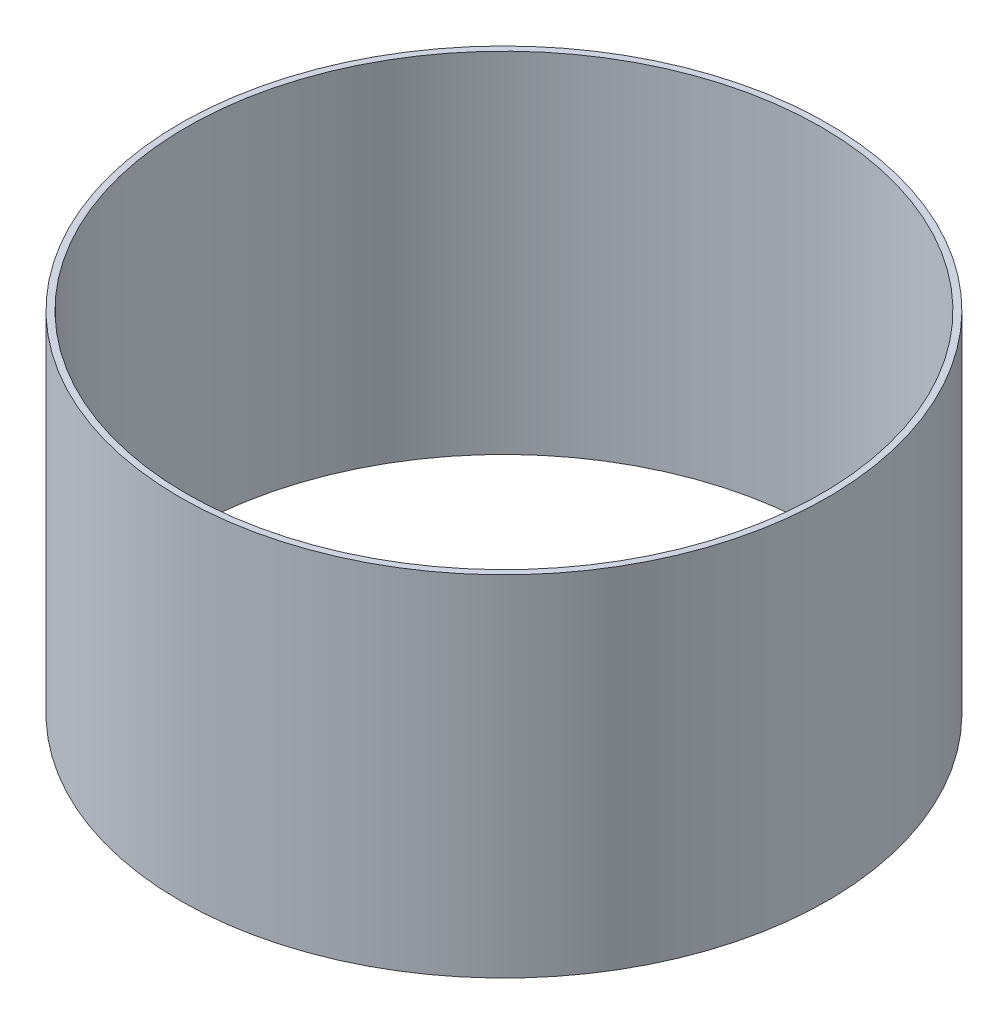
ISO-10303-21;
HEADER;
FILE_DESCRIPTION(('STEP AP214'),'2;1');
FILE_NAME('part.step','',(''),(''),'','','');
FILE_SCHEMA(('AUTOMOTIVE_DESIGN { 1 0 10303 214 1 1 1 1 }'));
ENDSEC;
DATA;
#1=APPLICATION_CONTEXT('core data for automotive mechanical design processes');
#2=APPLICATION_PROTOCOL_DEFINITION('international standard','automotive_design',2000,#1);
#3=PRODUCT_CONTEXT('',#1,'mechanical');
#4=PRODUCT('Part','Part','',(#3));
#5=PRODUCT_RELATED_PRODUCT_CATEGORY('part','',(#4));
#6=PRODUCT_DEFINITION_FORMATION('','',#4);
#7=PRODUCT_DEFINITION_CONTEXT('part definition',#1,'design');
#8=PRODUCT_DEFINITION('design','',#6,#7);
#9=PRODUCT_DEFINITION_SHAPE('','',#8);
#10=(LENGTH_UNIT() NAMED_UNIT(*) SI_UNIT(.MILLI.,.METRE.));
#11=(NAMED_UNIT(*) PLANE_ANGLE_UNIT() SI_UNIT($,.RADIAN.));
#12=(NAMED_UNIT(*) SI_UNIT($,.STERADIAN.) SOLID_ANGLE_UNIT());
#13=UNCERTAINTY_MEASURE_WITH_UNIT(LENGTH_MEASURE(1.E-05),#10,'distance_accuracy_value','');
#14=(GEOMETRIC_REPRESENTATION_CONTEXT(3) GLOBAL_UNCERTAINTY_ASSIGNED_CONTEXT((#13)) GLOBAL_UNIT_ASSIGNED_CONTEXT((#10,
#11,#12)) REPRESENTATION_CONTEXT('',''));
#15=CARTESIAN_POINT('',(0.,0.,0.));
#16=DIRECTION('',(0.,0.,1.));
#17=DIRECTION('',(1.,0.,0.));
#18=AXIS2_PLACEMENT_3D('',#15,#16,#17);
#19=CARTESIAN_POINT('',(0.,55.,0.));
#20=DIRECTION('',(0.,1.,0.));
#21=DIRECTION('',(0.,0.,1.));
#22=AXIS2_PLACEMENT_3D('',#19,#20,#21);
#23=PLANE('',#22);
#24=CARTESIAN_POINT('',(0.,55.,0.));
#25=DIRECTION('',(0.,1.,0.));
#26=DIRECTION('',(0.,0.,1.));
#27=AXIS2_PLACEMENT_3D('',#24,#25,#26);
#28=CIRCLE('',#27,51.);
#29=CARTESIAN_POINT('',(0.,55.,51.));
#30=VERTEX_POINT('',#29);
#31=EDGE_CURVE('E10',#30,#30,#28,.T.);
#32=ORIENTED_EDGE('',*,*,#31,.T.);
#33=EDGE_LOOP('',(#32));
#34=FACE_BOUND('',#33,.T.);
#35=CARTESIAN_POINT('',(0.,55.,0.));
#36=DIRECTION('',(0.,1.,0.));
#37=DIRECTION('',(0.,0.,1.));
#38=AXIS2_PLACEMENT_3D('',#35,#36,#37);
#39=CIRCLE('',#38,50.);
#40=CARTESIAN_POINT('',(0.,55.,50.));
#41=VERTEX_POINT('',#40);
#42=EDGE_CURVE('E50',#41,#41,#39,.T.);
#43=ORIENTED_EDGE('',*,*,#42,.F.);
#44=EDGE_LOOP('',(#43));
#45=FACE_BOUND('',#44,.T.);
#46=ADVANCED_FACE('F37',(#34,#45),#23,.T.);
#47=CARTESIAN_POINT('',(0.,0.,0.));
#48=DIRECTION('',(0.,1.,0.));
#49=DIRECTION('',(0.,0.,1.));
#50=AXIS2_PLACEMENT_3D('',#47,#48,#49);
#51=PLANE('',#50);
#52=CARTESIAN_POINT('',(0.,0.,0.));
#53=DIRECTION('',(0.,1.,0.));
#54=DIRECTION('',(0.,0.,1.));
#55=AXIS2_PLACEMENT_3D('',#52,#53,#54);
#56=CIRCLE('',#55,51.);
#57=CARTESIAN_POINT('',(0.,0.,51.));
#58=VERTEX_POINT('',#57);
#59=EDGE_CURVE('E41',#58,#58,#56,.T.);
#60=ORIENTED_EDGE('',*,*,#59,.F.);
#61=EDGE_LOOP('',(#60));
#62=FACE_BOUND('',#61,.T.);
#63=CARTESIAN_POINT('',(0.,0.,0.));
#64=DIRECTION('',(0.,1.,0.));
#65=DIRECTION('',(0.,0.,1.));
#66=AXIS2_PLACEMENT_3D('',#63,#64,#65);
#67=CIRCLE('',#66,50.);
#68=CARTESIAN_POINT('',(0.,0.,50.));
#69=VERTEX_POINT('',#68);
#70=EDGE_CURVE('E52',#69,#69,#67,.T.);
#71=ORIENTED_EDGE('',*,*,#70,.T.);
#72=EDGE_LOOP('',(#71));
#73=FACE_BOUND('',#72,.T.);
#74=ADVANCED_FACE('F64',(#62,#73),#51,.F.);
#75=CARTESIAN_POINT('',(0.,55.,0.));
#76=DIRECTION('',(0.,-1.,0.));
#77=DIRECTION('',(0.,0.,-1.));
#78=AXIS2_PLACEMENT_3D('',#75,#76,#77);
#79=CYLINDRICAL_SURFACE('',#78,51.);
#80=ORIENTED_EDGE('',*,*,#31,.F.);
#81=EDGE_LOOP('',(#80));
#82=FACE_BOUND('',#81,.T.);
#83=ORIENTED_EDGE('',*,*,#59,.T.);
#84=EDGE_LOOP('',(#83));
#85=FACE_BOUND('',#84,.T.);
#86=ADVANCED_FACE('F39',(#82,#85),#79,.T.);
#87=CARTESIAN_POINT('',(0.,55.,0.));
#88=DIRECTION('',(0.,-1.,0.));
#89=DIRECTION('',(0.,0.,-1.));
#90=AXIS2_PLACEMENT_3D('',#87,#88,#89);
#91=CYLINDRICAL_SURFACE('',#90,50.);
#92=ORIENTED_EDGE('',*,*,#42,.T.);
#93=EDGE_LOOP('',(#92));
#94=FACE_BOUND('',#93,.T.);
#95=ORIENTED_EDGE('',*,*,#70,.F.);
#96=EDGE_LOOP('',(#95));
#97=FACE_BOUND('',#96,.T.);
#98=ADVANCED_FACE('F60',(#94,#97),#91,.F.);
#99=CLOSED_SHELL('',(#46,#74,#86,#98));
#100=MANIFOLD_SOLID_BREP('B2',#99);
#101=ADVANCED_BREP_SHAPE_REPRESENTATION('',(#18,#100),#14);
#102=SHAPE_DEFINITION_REPRESENTATION(#9,#101);
ENDSEC;
END-ISO-10303-21;
